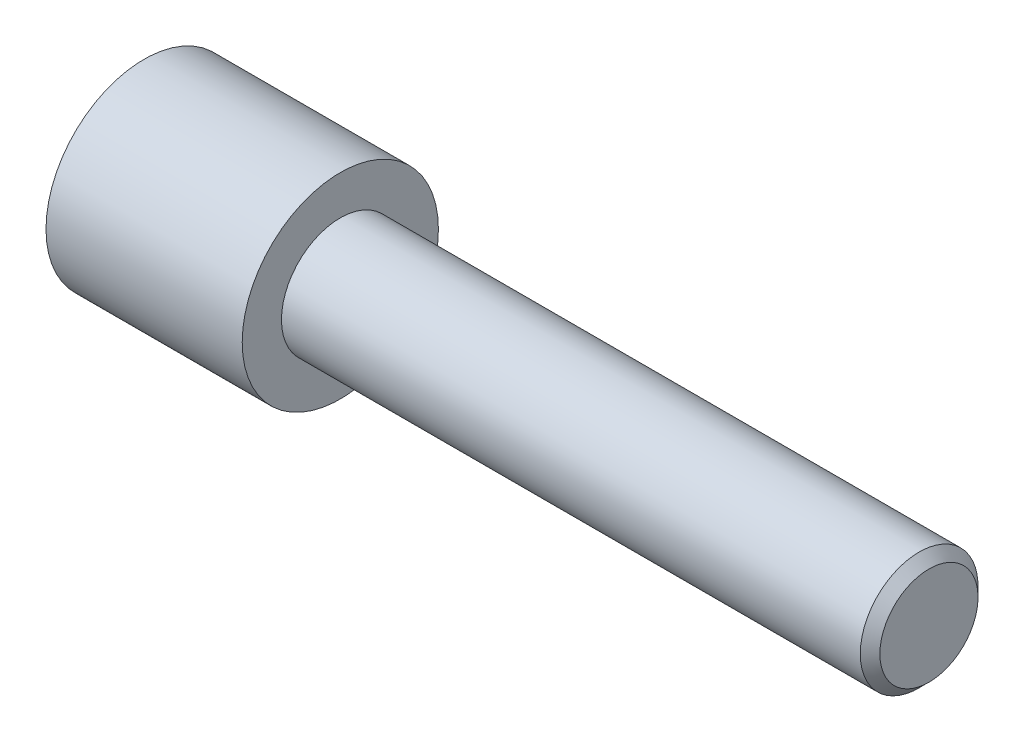
ISO-10303-21;
HEADER;
FILE_DESCRIPTION(('STEP AP214'),'2;1');
FILE_NAME('part.step','',(''),(''),'','','');
FILE_SCHEMA(('AUTOMOTIVE_DESIGN { 1 0 10303 214 1 1 1 1 }'));
ENDSEC;
DATA;
#1=APPLICATION_CONTEXT('core data for automotive mechanical design processes');
#2=APPLICATION_PROTOCOL_DEFINITION('international standard','automotive_design',2000,#1);
#3=PRODUCT_CONTEXT('',#1,'mechanical');
#4=PRODUCT('Part','Part','',(#3));
#5=PRODUCT_RELATED_PRODUCT_CATEGORY('part','',(#4));
#6=PRODUCT_DEFINITION_FORMATION('','',#4);
#7=PRODUCT_DEFINITION_CONTEXT('part definition',#1,'design');
#8=PRODUCT_DEFINITION('design','',#6,#7);
#9=PRODUCT_DEFINITION_SHAPE('','',#8);
#10=(LENGTH_UNIT() NAMED_UNIT(*) SI_UNIT(.MILLI.,.METRE.));
#11=(NAMED_UNIT(*) PLANE_ANGLE_UNIT() SI_UNIT($,.RADIAN.));
#12=(NAMED_UNIT(*) SI_UNIT($,.STERADIAN.) SOLID_ANGLE_UNIT());
#13=UNCERTAINTY_MEASURE_WITH_UNIT(LENGTH_MEASURE(1.E-05),#10,'distance_accuracy_value','');
#14=(GEOMETRIC_REPRESENTATION_CONTEXT(3) GLOBAL_UNCERTAINTY_ASSIGNED_CONTEXT((#13)) GLOBAL_UNIT_ASSIGNED_CONTEXT((#10,
#11,#12)) REPRESENTATION_CONTEXT('',''));
#15=CARTESIAN_POINT('',(0.,0.,0.));
#16=DIRECTION('',(0.,0.,1.));
#17=DIRECTION('',(1.,0.,0.));
#18=AXIS2_PLACEMENT_3D('',#15,#16,#17);
#19=CARTESIAN_POINT('',(0.,0.,0.));
#20=DIRECTION('',(-1.,0.,0.));
#21=DIRECTION('',(0.,0.,1.));
#22=AXIS2_PLACEMENT_3D('',#19,#20,#21);
#23=CYLINDRICAL_SURFACE('',#22,6.00000000000001);
#24=CARTESIAN_POINT('',(59.,0.,0.));
#25=DIRECTION('',(-1.,0.,0.));
#26=DIRECTION('',(0.,0.,1.));
#27=AXIS2_PLACEMENT_3D('',#24,#25,#26);
#28=CIRCLE('',#27,6.00000000000001);
#29=CARTESIAN_POINT('',(59.,0.,6.00000000000001));
#30=VERTEX_POINT('',#29);
#31=EDGE_CURVE('E49',#30,#30,#28,.T.);
#32=ORIENTED_EDGE('',*,*,#31,.T.);
#33=EDGE_LOOP('',(#32));
#34=FACE_BOUND('',#33,.T.);
#35=CARTESIAN_POINT('',(0.,0.,0.));
#36=DIRECTION('',(-1.,0.,0.));
#37=DIRECTION('',(0.,0.,1.));
#38=AXIS2_PLACEMENT_3D('',#35,#36,#37);
#39=CIRCLE('',#38,6.00000000000001);
#40=CARTESIAN_POINT('',(0.,0.,6.00000000000001));
#41=VERTEX_POINT('',#40);
#42=EDGE_CURVE('E53',#41,#41,#39,.T.);
#43=ORIENTED_EDGE('',*,*,#42,.F.);
#44=EDGE_LOOP('',(#43));
#45=FACE_BOUND('',#44,.T.);
#46=ADVANCED_FACE('F41',(#34,#45),#23,.T.);
#47=CARTESIAN_POINT('',(60.,0.,0.));
#48=DIRECTION('',(-1.,0.,0.));
#49=DIRECTION('',(0.,0.,1.));
#50=AXIS2_PLACEMENT_3D('',#47,#48,#49);
#51=PLANE('',#50);
#52=CARTESIAN_POINT('',(60.,0.,0.));
#53=DIRECTION('',(-1.,0.,0.));
#54=DIRECTION('',(0.,0.,1.));
#55=AXIS2_PLACEMENT_3D('',#52,#53,#54);
#56=CIRCLE('',#55,4.99999999999999);
#57=CARTESIAN_POINT('',(60.,0.,4.99999999999999));
#58=VERTEX_POINT('',#57);
#59=EDGE_CURVE('E10',#58,#58,#56,.F.);
#60=ORIENTED_EDGE('',*,*,#59,.T.);
#61=EDGE_LOOP('',(#60));
#62=FACE_BOUND('',#61,.T.);
#63=ADVANCED_FACE('F81',(#62),#51,.F.);
#64=CARTESIAN_POINT('',(-20.,0.,0.));
#65=DIRECTION('',(-1.,0.,0.));
#66=DIRECTION('',(0.,0.,1.));
#67=AXIS2_PLACEMENT_3D('',#64,#65,#66);
#68=PLANE('',#67);
#69=CARTESIAN_POINT('',(-20.,0.,0.));
#70=DIRECTION('',(-1.,0.,0.));
#71=DIRECTION('',(0.,0.,1.));
#72=AXIS2_PLACEMENT_3D('',#69,#70,#71);
#73=CIRCLE('',#72,10.);
#74=CARTESIAN_POINT('',(-20.,0.,10.));
#75=VERTEX_POINT('',#74);
#76=EDGE_CURVE('E62',#75,#75,#73,.T.);
#77=ORIENTED_EDGE('',*,*,#76,.T.);
#78=EDGE_LOOP('',(#77));
#79=FACE_BOUND('',#78,.T.);
#80=ADVANCED_FACE('F66',(#79),#68,.T.);
#81=CARTESIAN_POINT('',(0.,0.,0.));
#82=DIRECTION('',(-1.,0.,0.));
#83=DIRECTION('',(0.,0.,1.));
#84=AXIS2_PLACEMENT_3D('',#81,#82,#83);
#85=CYLINDRICAL_SURFACE('',#84,10.);
#86=ORIENTED_EDGE('',*,*,#76,.F.);
#87=EDGE_LOOP('',(#86));
#88=FACE_BOUND('',#87,.T.);
#89=CARTESIAN_POINT('',(0.,0.,0.));
#90=DIRECTION('',(-1.,0.,0.));
#91=DIRECTION('',(0.,0.,1.));
#92=AXIS2_PLACEMENT_3D('',#89,#90,#91);
#93=CIRCLE('',#92,10.);
#94=CARTESIAN_POINT('',(0.,0.,10.));
#95=VERTEX_POINT('',#94);
#96=EDGE_CURVE('E57',#95,#95,#93,.T.);
#97=ORIENTED_EDGE('',*,*,#96,.T.);
#98=EDGE_LOOP('',(#97));
#99=FACE_BOUND('',#98,.T.);
#100=ADVANCED_FACE('F68',(#88,#99),#85,.T.);
#101=CARTESIAN_POINT('',(0.,0.,0.));
#102=DIRECTION('',(-1.,0.,0.));
#103=DIRECTION('',(0.,0.,1.));
#104=AXIS2_PLACEMENT_3D('',#101,#102,#103);
#105=PLANE('',#104);
#106=ORIENTED_EDGE('',*,*,#42,.T.);
#107=EDGE_LOOP('',(#106));
#108=FACE_BOUND('',#107,.T.);
#109=ORIENTED_EDGE('',*,*,#96,.F.);
#110=EDGE_LOOP('',(#109));
#111=FACE_BOUND('',#110,.T.);
#112=ADVANCED_FACE('F71',(#108,#111),#105,.F.);
#113=CARTESIAN_POINT('',(59.,0.,0.));
#114=DIRECTION('',(-1.,0.,0.));
#115=DIRECTION('',(0.,0.,1.));
#116=AXIS2_PLACEMENT_3D('',#113,#114,#115);
#117=CONICAL_SURFACE('',#116,6.00000000000001,0.785398163397455);
#118=ORIENTED_EDGE('',*,*,#59,.F.);
#119=EDGE_LOOP('',(#118));
#120=FACE_BOUND('',#119,.T.);
#121=ORIENTED_EDGE('',*,*,#31,.F.);
#122=EDGE_LOOP('',(#121));
#123=FACE_BOUND('',#122,.T.);
#124=ADVANCED_FACE('F44',(#120,#123),#117,.T.);
#125=CLOSED_SHELL('',(#46,#63,#80,#100,#112,#124));
#126=MANIFOLD_SOLID_BREP('B2',#125);
#127=ADVANCED_BREP_SHAPE_REPRESENTATION('',(#18,#126),#14);
#128=SHAPE_DEFINITION_REPRESENTATION(#9,#127);
ENDSEC;
END-ISO-10303-21;
